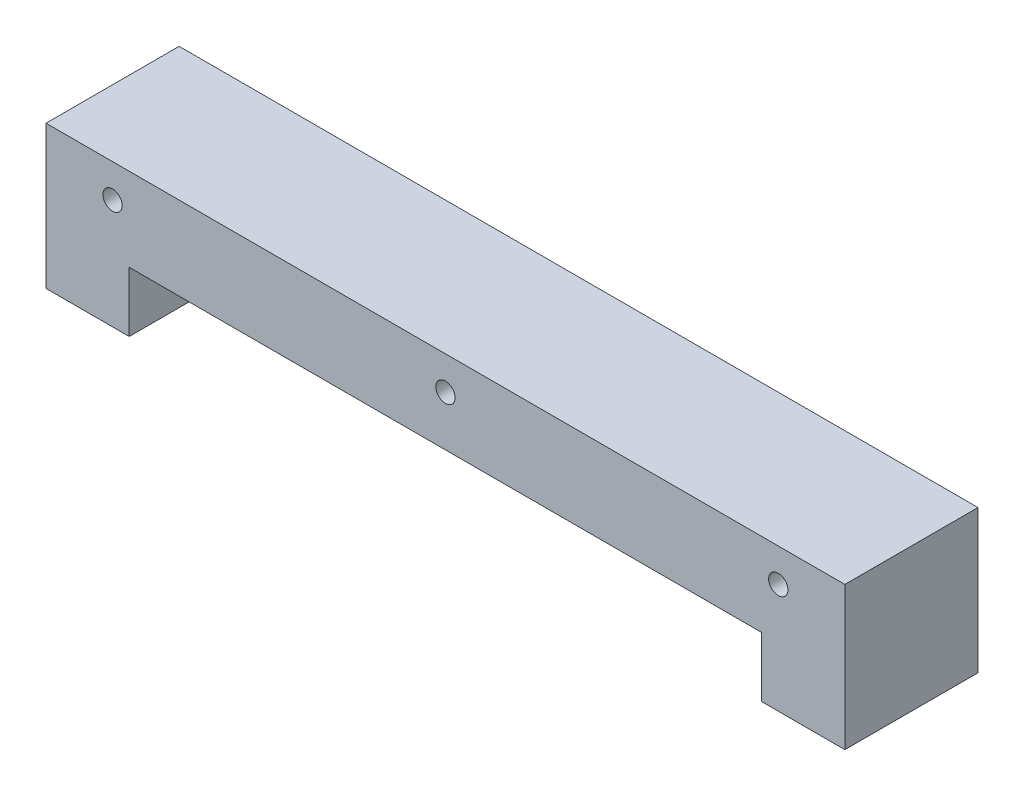
ISO-10303-21;
HEADER;
FILE_DESCRIPTION(('STEP AP214'),'2;1');
FILE_NAME('part.step','',(''),(''),'','','');
FILE_SCHEMA(('AUTOMOTIVE_DESIGN { 1 0 10303 214 1 1 1 1 }'));
ENDSEC;
DATA;
#1=APPLICATION_CONTEXT('core data for automotive mechanical design processes');
#2=APPLICATION_PROTOCOL_DEFINITION('international standard','automotive_design',2000,#1);
#3=PRODUCT_CONTEXT('',#1,'mechanical');
#4=PRODUCT('Part','Part','',(#3));
#5=PRODUCT_RELATED_PRODUCT_CATEGORY('part','',(#4));
#6=PRODUCT_DEFINITION_FORMATION('','',#4);
#7=PRODUCT_DEFINITION_CONTEXT('part definition',#1,'design');
#8=PRODUCT_DEFINITION('design','',#6,#7);
#9=PRODUCT_DEFINITION_SHAPE('','',#8);
#10=(LENGTH_UNIT() NAMED_UNIT(*) SI_UNIT(.MILLI.,.METRE.));
#11=(NAMED_UNIT(*) PLANE_ANGLE_UNIT() SI_UNIT($,.RADIAN.));
#12=(NAMED_UNIT(*) SI_UNIT($,.STERADIAN.) SOLID_ANGLE_UNIT());
#13=UNCERTAINTY_MEASURE_WITH_UNIT(LENGTH_MEASURE(1.E-05),#10,'distance_accuracy_value','');
#14=(GEOMETRIC_REPRESENTATION_CONTEXT(3) GLOBAL_UNCERTAINTY_ASSIGNED_CONTEXT((#13)) GLOBAL_UNIT_ASSIGNED_CONTEXT((#10,
#11,#12)) REPRESENTATION_CONTEXT('',''));
#15=CARTESIAN_POINT('',(0.,0.,0.));
#16=DIRECTION('',(0.,0.,1.));
#17=DIRECTION('',(1.,0.,0.));
#18=AXIS2_PLACEMENT_3D('',#15,#16,#17);
#19=CARTESIAN_POINT('',(0.,0.,0.));
#20=DIRECTION('',(0.,-1.,0.));
#21=DIRECTION('',(0.,0.,-1.));
#22=AXIS2_PLACEMENT_3D('',#19,#20,#21);
#23=PLANE('',#22);
#24=DIRECTION('',(0.,0.,-1.));
#25=VECTOR('',#24,1.);
#26=CARTESIAN_POINT('',(-95.,0.,0.));
#27=LINE('',#26,#25);
#28=CARTESIAN_POINT('',(-95.,0.,20.));
#29=VERTEX_POINT('',#28);
#30=CARTESIAN_POINT('',(-95.,0.,-20.));
#31=VERTEX_POINT('',#30);
#32=EDGE_CURVE('E11',#29,#31,#27,.T.);
#33=ORIENTED_EDGE('',*,*,#32,.F.);
#34=DIRECTION('',(1.,0.,0.));
#35=VECTOR('',#34,1.);
#36=CARTESIAN_POINT('',(-120.,0.,20.));
#37=LINE('',#36,#35);
#38=CARTESIAN_POINT('',(-120.,0.,20.));
#39=VERTEX_POINT('',#38);
#40=EDGE_CURVE('E122',#39,#29,#37,.T.);
#41=ORIENTED_EDGE('',*,*,#40,.F.);
#42=DIRECTION('',(0.,0.,1.));
#43=VECTOR('',#42,1.);
#44=CARTESIAN_POINT('',(-120.,0.,20.));
#45=LINE('',#44,#43);
#46=CARTESIAN_POINT('',(-120.,0.,-20.));
#47=VERTEX_POINT('',#46);
#48=EDGE_CURVE('E132',#47,#39,#45,.T.);
#49=ORIENTED_EDGE('',*,*,#48,.F.);
#50=DIRECTION('',(-1.,0.,0.));
#51=VECTOR('',#50,1.);
#52=CARTESIAN_POINT('',(-120.,0.,-20.));
#53=LINE('',#52,#51);
#54=EDGE_CURVE('E130',#31,#47,#53,.T.);
#55=ORIENTED_EDGE('',*,*,#54,.F.);
#56=EDGE_LOOP('',(#33,#41,#49,#55));
#57=FACE_BOUND('',#56,.T.);
#58=ADVANCED_FACE('F17',(#57),#23,.T.);
#59=CARTESIAN_POINT('',(120.,43.,20.));
#60=DIRECTION('',(-1.,0.,0.));
#61=DIRECTION('',(0.,0.,1.));
#62=AXIS2_PLACEMENT_3D('',#59,#60,#61);
#63=PLANE('',#62);
#64=DIRECTION('',(0.,0.,-1.));
#65=VECTOR('',#64,1.);
#66=CARTESIAN_POINT('',(120.,0.,20.));
#67=LINE('',#66,#65);
#68=CARTESIAN_POINT('',(120.,0.,20.));
#69=VERTEX_POINT('',#68);
#70=CARTESIAN_POINT('',(120.,0.,-20.));
#71=VERTEX_POINT('',#70);
#72=EDGE_CURVE('E118',#69,#71,#67,.T.);
#73=ORIENTED_EDGE('',*,*,#72,.T.);
#74=DIRECTION('',(0.,-1.,0.));
#75=VECTOR('',#74,1.);
#76=CARTESIAN_POINT('',(120.,43.,-20.));
#77=LINE('',#76,#75);
#78=CARTESIAN_POINT('',(120.,43.,-20.));
#79=VERTEX_POINT('',#78);
#80=EDGE_CURVE('E143',#79,#71,#77,.T.);
#81=ORIENTED_EDGE('',*,*,#80,.F.);
#82=DIRECTION('',(0.,0.,-1.));
#83=VECTOR('',#82,1.);
#84=CARTESIAN_POINT('',(120.,43.,20.));
#85=LINE('',#84,#83);
#86=CARTESIAN_POINT('',(120.,43.,20.));
#87=VERTEX_POINT('',#86);
#88=EDGE_CURVE('E120',#87,#79,#85,.T.);
#89=ORIENTED_EDGE('',*,*,#88,.F.);
#90=DIRECTION('',(0.,-1.,0.));
#91=VECTOR('',#90,1.);
#92=CARTESIAN_POINT('',(120.,43.,20.));
#93=LINE('',#92,#91);
#94=EDGE_CURVE('E127',#87,#69,#93,.T.);
#95=ORIENTED_EDGE('',*,*,#94,.T.);
#96=EDGE_LOOP('',(#73,#81,#89,#95));
#97=FACE_BOUND('',#96,.T.);
#98=ADVANCED_FACE('F19',(#97),#63,.F.);
#99=CARTESIAN_POINT('',(-120.,43.,-20.));
#100=DIRECTION('',(0.,0.,1.));
#101=DIRECTION('',(1.,0.,0.));
#102=AXIS2_PLACEMENT_3D('',#99,#100,#101);
#103=PLANE('',#102);
#104=CARTESIAN_POINT('',(-100.,33.,-20.));
#105=DIRECTION('',(0.,0.,1.));
#106=DIRECTION('',(1.,0.,0.));
#107=AXIS2_PLACEMENT_3D('',#104,#105,#106);
#108=CIRCLE('',#107,2.9);
#109=CARTESIAN_POINT('',(-97.1,33.,-20.));
#110=VERTEX_POINT('',#109);
#111=EDGE_CURVE('E191',#110,#110,#108,.T.);
#112=ORIENTED_EDGE('',*,*,#111,.T.);
#113=EDGE_LOOP('',(#112));
#114=FACE_BOUND('',#113,.T.);
#115=CARTESIAN_POINT('',(0.,33.,-20.));
#116=DIRECTION('',(0.,0.,1.));
#117=DIRECTION('',(1.,0.,0.));
#118=AXIS2_PLACEMENT_3D('',#115,#116,#117);
#119=CIRCLE('',#118,2.9);
#120=CARTESIAN_POINT('',(2.90000000000006,33.,-20.));
#121=VERTEX_POINT('',#120);
#122=EDGE_CURVE('E195',#121,#121,#119,.T.);
#123=ORIENTED_EDGE('',*,*,#122,.T.);
#124=EDGE_LOOP('',(#123));
#125=FACE_BOUND('',#124,.T.);
#126=CARTESIAN_POINT('',(100.,33.,-20.));
#127=DIRECTION('',(0.,0.,1.));
#128=DIRECTION('',(1.,0.,0.));
#129=AXIS2_PLACEMENT_3D('',#126,#127,#128);
#130=CIRCLE('',#129,2.9);
#131=CARTESIAN_POINT('',(102.9,33.,-20.));
#132=VERTEX_POINT('',#131);
#133=EDGE_CURVE('E115',#132,#132,#130,.T.);
#134=ORIENTED_EDGE('',*,*,#133,.T.);
#135=EDGE_LOOP('',(#134));
#136=FACE_BOUND('',#135,.T.);
#137=DIRECTION('',(-1.,0.,0.));
#138=VECTOR('',#137,1.);
#139=CARTESIAN_POINT('',(-95.,18.,-20.));
#140=LINE('',#139,#138);
#141=CARTESIAN_POINT('',(95.,18.,-20.));
#142=VERTEX_POINT('',#141);
#143=CARTESIAN_POINT('',(-95.,18.,-20.));
#144=VERTEX_POINT('',#143);
#145=EDGE_CURVE('E97',#142,#144,#140,.T.);
#146=ORIENTED_EDGE('',*,*,#145,.T.);
#147=DIRECTION('',(0.,-1.,0.));
#148=VECTOR('',#147,1.);
#149=CARTESIAN_POINT('',(-95.,18.,-20.));
#150=LINE('',#149,#148);
#151=EDGE_CURVE('E107',#144,#31,#150,.T.);
#152=ORIENTED_EDGE('',*,*,#151,.T.);
#153=ORIENTED_EDGE('',*,*,#54,.T.);
#154=DIRECTION('',(0.,-1.,0.));
#155=VECTOR('',#154,1.);
#156=CARTESIAN_POINT('',(-120.,43.,-20.));
#157=LINE('',#156,#155);
#158=CARTESIAN_POINT('',(-120.,43.,-20.));
#159=VERTEX_POINT('',#158);
#160=EDGE_CURVE('E140',#159,#47,#157,.T.);
#161=ORIENTED_EDGE('',*,*,#160,.F.);
#162=DIRECTION('',(-1.,0.,0.));
#163=VECTOR('',#162,1.);
#164=CARTESIAN_POINT('',(-120.,43.,-20.));
#165=LINE('',#164,#163);
#166=EDGE_CURVE('E70',#79,#159,#165,.T.);
#167=ORIENTED_EDGE('',*,*,#166,.F.);
#168=ORIENTED_EDGE('',*,*,#80,.T.);
#169=CARTESIAN_POINT('',(95.,0.,-20.));
#170=VERTEX_POINT('',#169);
#171=EDGE_CURVE('E106',#71,#170,#53,.T.);
#172=ORIENTED_EDGE('',*,*,#171,.T.);
#173=DIRECTION('',(0.,1.,0.));
#174=VECTOR('',#173,1.);
#175=CARTESIAN_POINT('',(95.,18.,-20.));
#176=LINE('',#175,#174);
#177=EDGE_CURVE('E32',#170,#142,#176,.T.);
#178=ORIENTED_EDGE('',*,*,#177,.T.);
#179=EDGE_LOOP('',(#146,#152,#153,#161,#167,#168,#172,#178));
#180=FACE_BOUND('',#179,.T.);
#181=ADVANCED_FACE('F105',(#114,#125,#136,#180),#103,.F.);
#182=CARTESIAN_POINT('',(-120.,43.,20.));
#183=DIRECTION('',(1.,0.,0.));
#184=DIRECTION('',(0.,0.,-1.));
#185=AXIS2_PLACEMENT_3D('',#182,#183,#184);
#186=PLANE('',#185);
#187=ORIENTED_EDGE('',*,*,#48,.T.);
#188=DIRECTION('',(0.,-1.,0.));
#189=VECTOR('',#188,1.);
#190=CARTESIAN_POINT('',(-120.,43.,20.));
#191=LINE('',#190,#189);
#192=CARTESIAN_POINT('',(-120.,43.,20.));
#193=VERTEX_POINT('',#192);
#194=EDGE_CURVE('E137',#193,#39,#191,.T.);
#195=ORIENTED_EDGE('',*,*,#194,.F.);
#196=DIRECTION('',(0.,0.,1.));
#197=VECTOR('',#196,1.);
#198=CARTESIAN_POINT('',(-120.,43.,20.));
#199=LINE('',#198,#197);
#200=EDGE_CURVE('E124',#159,#193,#199,.T.);
#201=ORIENTED_EDGE('',*,*,#200,.F.);
#202=ORIENTED_EDGE('',*,*,#160,.T.);
#203=EDGE_LOOP('',(#187,#195,#201,#202));
#204=FACE_BOUND('',#203,.T.);
#205=ADVANCED_FACE('F162',(#204),#186,.F.);
#206=CARTESIAN_POINT('',(-120.,43.,20.));
#207=DIRECTION('',(0.,0.,-1.));
#208=DIRECTION('',(-1.,0.,0.));
#209=AXIS2_PLACEMENT_3D('',#206,#207,#208);
#210=PLANE('',#209);
#211=CARTESIAN_POINT('',(-100.,33.,20.));
#212=DIRECTION('',(0.,0.,1.));
#213=DIRECTION('',(1.,0.,0.));
#214=AXIS2_PLACEMENT_3D('',#211,#212,#213);
#215=CIRCLE('',#214,2.9);
#216=CARTESIAN_POINT('',(-97.1,33.,20.));
#217=VERTEX_POINT('',#216);
#218=EDGE_CURVE('E208',#217,#217,#215,.T.);
#219=ORIENTED_EDGE('',*,*,#218,.F.);
#220=EDGE_LOOP('',(#219));
#221=FACE_BOUND('',#220,.T.);
#222=CARTESIAN_POINT('',(0.,33.,20.));
#223=DIRECTION('',(0.,0.,1.));
#224=DIRECTION('',(1.,0.,0.));
#225=AXIS2_PLACEMENT_3D('',#222,#223,#224);
#226=CIRCLE('',#225,2.9);
#227=CARTESIAN_POINT('',(2.90000000000006,33.,20.));
#228=VERTEX_POINT('',#227);
#229=EDGE_CURVE('E204',#228,#228,#226,.T.);
#230=ORIENTED_EDGE('',*,*,#229,.F.);
#231=EDGE_LOOP('',(#230));
#232=FACE_BOUND('',#231,.T.);
#233=CARTESIAN_POINT('',(100.,33.,20.));
#234=DIRECTION('',(0.,0.,1.));
#235=DIRECTION('',(1.,0.,0.));
#236=AXIS2_PLACEMENT_3D('',#233,#234,#235);
#237=CIRCLE('',#236,2.9);
#238=CARTESIAN_POINT('',(102.9,33.,20.));
#239=VERTEX_POINT('',#238);
#240=EDGE_CURVE('E199',#239,#239,#237,.T.);
#241=ORIENTED_EDGE('',*,*,#240,.F.);
#242=EDGE_LOOP('',(#241));
#243=FACE_BOUND('',#242,.T.);
#244=ORIENTED_EDGE('',*,*,#40,.T.);
#245=DIRECTION('',(0.,-1.,0.));
#246=VECTOR('',#245,1.);
#247=CARTESIAN_POINT('',(-95.,18.,20.));
#248=LINE('',#247,#246);
#249=CARTESIAN_POINT('',(-95.,18.,20.));
#250=VERTEX_POINT('',#249);
#251=EDGE_CURVE('E113',#250,#29,#248,.T.);
#252=ORIENTED_EDGE('',*,*,#251,.F.);
#253=DIRECTION('',(-1.,0.,0.));
#254=VECTOR('',#253,1.);
#255=CARTESIAN_POINT('',(-95.,18.,20.));
#256=LINE('',#255,#254);
#257=CARTESIAN_POINT('',(95.,18.,20.));
#258=VERTEX_POINT('',#257);
#259=EDGE_CURVE('E109',#258,#250,#256,.T.);
#260=ORIENTED_EDGE('',*,*,#259,.F.);
#261=DIRECTION('',(0.,1.,0.));
#262=VECTOR('',#261,1.);
#263=CARTESIAN_POINT('',(95.,18.,20.));
#264=LINE('',#263,#262);
#265=CARTESIAN_POINT('',(95.,0.,20.));
#266=VERTEX_POINT('',#265);
#267=EDGE_CURVE('E92',#266,#258,#264,.T.);
#268=ORIENTED_EDGE('',*,*,#267,.F.);
#269=EDGE_CURVE('E62',#266,#69,#37,.T.);
#270=ORIENTED_EDGE('',*,*,#269,.T.);
#271=ORIENTED_EDGE('',*,*,#94,.F.);
#272=DIRECTION('',(1.,0.,0.));
#273=VECTOR('',#272,1.);
#274=CARTESIAN_POINT('',(-120.,43.,20.));
#275=LINE('',#274,#273);
#276=EDGE_CURVE('E41',#193,#87,#275,.T.);
#277=ORIENTED_EDGE('',*,*,#276,.F.);
#278=ORIENTED_EDGE('',*,*,#194,.T.);
#279=EDGE_LOOP('',(#244,#252,#260,#268,#270,#271,#277,#278));
#280=FACE_BOUND('',#279,.T.);
#281=ADVANCED_FACE('F145',(#221,#232,#243,#280),#210,.F.);
#282=CARTESIAN_POINT('',(0.,43.,0.));
#283=DIRECTION('',(0.,-1.,0.));
#284=DIRECTION('',(0.,0.,-1.));
#285=AXIS2_PLACEMENT_3D('',#282,#283,#284);
#286=PLANE('',#285);
#287=ORIENTED_EDGE('',*,*,#88,.T.);
#288=ORIENTED_EDGE('',*,*,#166,.T.);
#289=ORIENTED_EDGE('',*,*,#200,.T.);
#290=ORIENTED_EDGE('',*,*,#276,.T.);
#291=EDGE_LOOP('',(#287,#288,#289,#290));
#292=FACE_BOUND('',#291,.T.);
#293=ADVANCED_FACE('F163',(#292),#286,.F.);
#294=DIRECTION('',(0.,0.,1.));
#295=VECTOR('',#294,1.);
#296=CARTESIAN_POINT('',(95.,0.,0.));
#297=LINE('',#296,#295);
#298=EDGE_CURVE('E25',#170,#266,#297,.T.);
#299=ORIENTED_EDGE('',*,*,#298,.F.);
#300=ORIENTED_EDGE('',*,*,#171,.F.);
#301=ORIENTED_EDGE('',*,*,#72,.F.);
#302=ORIENTED_EDGE('',*,*,#269,.F.);
#303=EDGE_LOOP('',(#299,#300,#301,#302));
#304=FACE_BOUND('',#303,.T.);
#305=ADVANCED_FACE('F148',(#304),#23,.T.);
#306=CARTESIAN_POINT('',(-95.,18.,-20.));
#307=DIRECTION('',(-1.,0.,0.));
#308=DIRECTION('',(0.,-1.,0.));
#309=AXIS2_PLACEMENT_3D('',#306,#307,#308);
#310=PLANE('',#309);
#311=ORIENTED_EDGE('',*,*,#32,.T.);
#312=ORIENTED_EDGE('',*,*,#151,.F.);
#313=DIRECTION('',(0.,0.,1.));
#314=VECTOR('',#313,1.);
#315=CARTESIAN_POINT('',(-95.,18.,-20.));
#316=LINE('',#315,#314);
#317=EDGE_CURVE('E96',#144,#250,#316,.T.);
#318=ORIENTED_EDGE('',*,*,#317,.T.);
#319=ORIENTED_EDGE('',*,*,#251,.T.);
#320=EDGE_LOOP('',(#311,#312,#318,#319));
#321=FACE_BOUND('',#320,.T.);
#322=ADVANCED_FACE('F161',(#321),#310,.F.);
#323=CARTESIAN_POINT('',(-95.,18.,-20.));
#324=DIRECTION('',(0.,1.,0.));
#325=DIRECTION('',(0.,0.,1.));
#326=AXIS2_PLACEMENT_3D('',#323,#324,#325);
#327=PLANE('',#326);
#328=ORIENTED_EDGE('',*,*,#259,.T.);
#329=ORIENTED_EDGE('',*,*,#317,.F.);
#330=ORIENTED_EDGE('',*,*,#145,.F.);
#331=DIRECTION('',(0.,0.,1.));
#332=VECTOR('',#331,1.);
#333=CARTESIAN_POINT('',(95.,18.,-20.));
#334=LINE('',#333,#332);
#335=EDGE_CURVE('E89',#142,#258,#334,.T.);
#336=ORIENTED_EDGE('',*,*,#335,.T.);
#337=EDGE_LOOP('',(#328,#329,#330,#336));
#338=FACE_BOUND('',#337,.T.);
#339=ADVANCED_FACE('F100',(#338),#327,.F.);
#340=CARTESIAN_POINT('',(95.,18.,-20.));
#341=DIRECTION('',(1.,0.,0.));
#342=DIRECTION('',(0.,1.,0.));
#343=AXIS2_PLACEMENT_3D('',#340,#341,#342);
#344=PLANE('',#343);
#345=ORIENTED_EDGE('',*,*,#298,.T.);
#346=ORIENTED_EDGE('',*,*,#267,.T.);
#347=ORIENTED_EDGE('',*,*,#335,.F.);
#348=ORIENTED_EDGE('',*,*,#177,.F.);
#349=EDGE_LOOP('',(#345,#346,#347,#348));
#350=FACE_BOUND('',#349,.T.);
#351=ADVANCED_FACE('F91',(#350),#344,.F.);
#352=CARTESIAN_POINT('',(100.,33.,20.));
#353=DIRECTION('',(0.,0.,1.));
#354=DIRECTION('',(1.,0.,0.));
#355=AXIS2_PLACEMENT_3D('',#352,#353,#354);
#356=CYLINDRICAL_SURFACE('',#355,2.9);
#357=ORIENTED_EDGE('',*,*,#133,.F.);
#358=EDGE_LOOP('',(#357));
#359=FACE_BOUND('',#358,.T.);
#360=ORIENTED_EDGE('',*,*,#240,.T.);
#361=EDGE_LOOP('',(#360));
#362=FACE_BOUND('',#361,.T.);
#363=ADVANCED_FACE('F218',(#359,#362),#356,.F.);
#364=CARTESIAN_POINT('',(0.,33.,20.));
#365=DIRECTION('',(0.,0.,1.));
#366=DIRECTION('',(1.,0.,0.));
#367=AXIS2_PLACEMENT_3D('',#364,#365,#366);
#368=CYLINDRICAL_SURFACE('',#367,2.9);
#369=ORIENTED_EDGE('',*,*,#122,.F.);
#370=EDGE_LOOP('',(#369));
#371=FACE_BOUND('',#370,.T.);
#372=ORIENTED_EDGE('',*,*,#229,.T.);
#373=EDGE_LOOP('',(#372));
#374=FACE_BOUND('',#373,.T.);
#375=ADVANCED_FACE('F220',(#371,#374),#368,.F.);
#376=CARTESIAN_POINT('',(-100.,33.,20.));
#377=DIRECTION('',(0.,0.,1.));
#378=DIRECTION('',(1.,0.,0.));
#379=AXIS2_PLACEMENT_3D('',#376,#377,#378);
#380=CYLINDRICAL_SURFACE('',#379,2.9);
#381=ORIENTED_EDGE('',*,*,#111,.F.);
#382=EDGE_LOOP('',(#381));
#383=FACE_BOUND('',#382,.T.);
#384=ORIENTED_EDGE('',*,*,#218,.T.);
#385=EDGE_LOOP('',(#384));
#386=FACE_BOUND('',#385,.T.);
#387=ADVANCED_FACE('F212',(#383,#386),#380,.F.);
#388=CLOSED_SHELL('',(#58,#98,#181,#205,#281,#293,#305,#322,#339,#351,#363,#375,#387));
#389=MANIFOLD_SOLID_BREP('B1',#388);
#390=ADVANCED_BREP_SHAPE_REPRESENTATION('',(#18,#389),#14);
#391=SHAPE_DEFINITION_REPRESENTATION(#9,#390);
ENDSEC;
END-ISO-10303-21;
